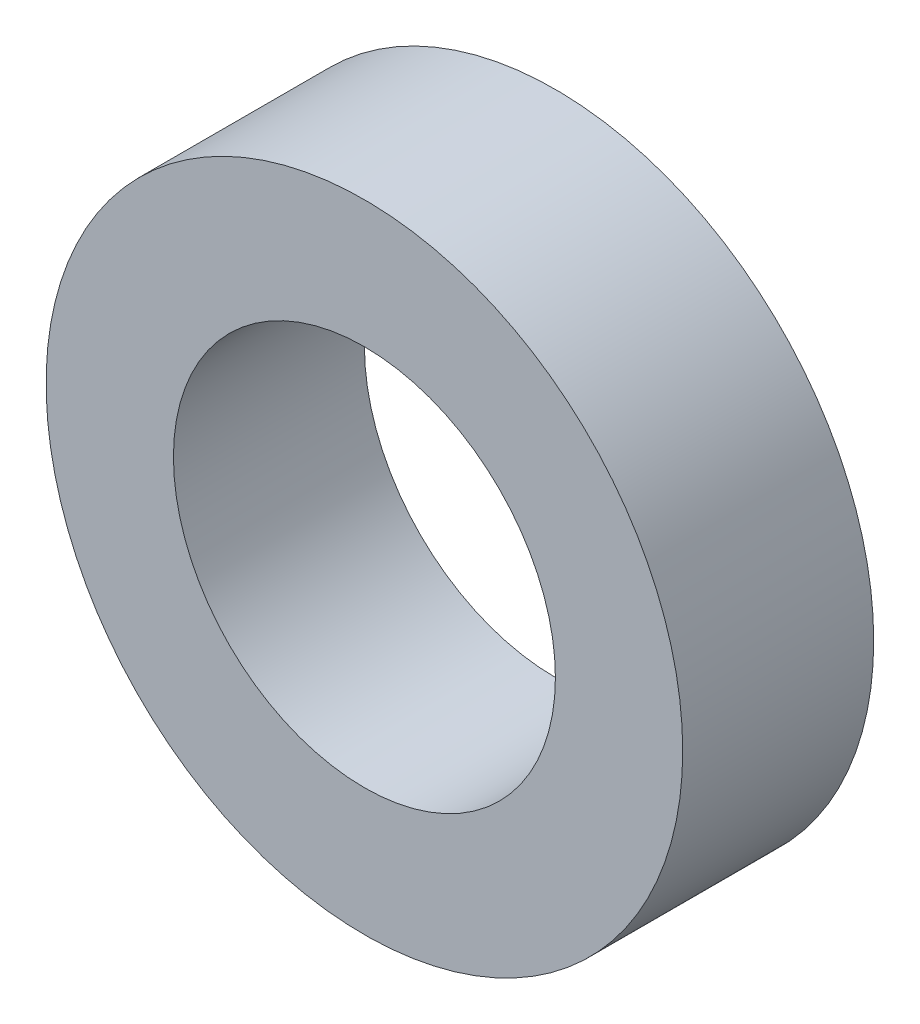
ISO-10303-21;
HEADER;
FILE_DESCRIPTION(('STEP AP214'),'2;1');
FILE_NAME('part.step','',(''),(''),'','','');
FILE_SCHEMA(('AUTOMOTIVE_DESIGN { 1 0 10303 214 1 1 1 1 }'));
ENDSEC;
DATA;
#1=APPLICATION_CONTEXT('core data for automotive mechanical design processes');
#2=APPLICATION_PROTOCOL_DEFINITION('international standard','automotive_design',2000,#1);
#3=PRODUCT_CONTEXT('',#1,'mechanical');
#4=PRODUCT('Part','Part','',(#3));
#5=PRODUCT_RELATED_PRODUCT_CATEGORY('part','',(#4));
#6=PRODUCT_DEFINITION_FORMATION('','',#4);
#7=PRODUCT_DEFINITION_CONTEXT('part definition',#1,'design');
#8=PRODUCT_DEFINITION('design','',#6,#7);
#9=PRODUCT_DEFINITION_SHAPE('','',#8);
#10=(LENGTH_UNIT() NAMED_UNIT(*) SI_UNIT(.MILLI.,.METRE.));
#11=(NAMED_UNIT(*) PLANE_ANGLE_UNIT() SI_UNIT($,.RADIAN.));
#12=(NAMED_UNIT(*) SI_UNIT($,.STERADIAN.) SOLID_ANGLE_UNIT());
#13=UNCERTAINTY_MEASURE_WITH_UNIT(LENGTH_MEASURE(1.E-05),#10,'distance_accuracy_value','');
#14=(GEOMETRIC_REPRESENTATION_CONTEXT(3) GLOBAL_UNCERTAINTY_ASSIGNED_CONTEXT((#13)) GLOBAL_UNIT_ASSIGNED_CONTEXT((#10,
#11,#12)) REPRESENTATION_CONTEXT('',''));
#15=CARTESIAN_POINT('',(0.,0.,0.));
#16=DIRECTION('',(0.,0.,1.));
#17=DIRECTION('',(1.,0.,0.));
#18=AXIS2_PLACEMENT_3D('',#15,#16,#17);
#19=CARTESIAN_POINT('',(0.,0.,6.));
#20=DIRECTION('',(0.,0.,1.));
#21=DIRECTION('',(1.,0.,0.));
#22=AXIS2_PLACEMENT_3D('',#19,#20,#21);
#23=PLANE('',#22);
#24=CARTESIAN_POINT('',(0.,0.,6.));
#25=DIRECTION('',(0.,0.,1.));
#26=DIRECTION('',(1.,0.,0.));
#27=AXIS2_PLACEMENT_3D('',#24,#25,#26);
#28=CIRCLE('',#27,10.);
#29=CARTESIAN_POINT('',(9.99999999999998,0.,5.99999999999999));
#30=VERTEX_POINT('',#29);
#31=EDGE_CURVE('E10',#30,#30,#28,.T.);
#32=ORIENTED_EDGE('',*,*,#31,.T.);
#33=EDGE_LOOP('',(#32));
#34=FACE_BOUND('',#33,.T.);
#35=CARTESIAN_POINT('',(0.,0.,6.));
#36=DIRECTION('',(0.,0.,1.));
#37=DIRECTION('',(1.,0.,0.));
#38=AXIS2_PLACEMENT_3D('',#35,#36,#37);
#39=CIRCLE('',#38,6.);
#40=CARTESIAN_POINT('',(5.99999999999998,0.,5.99999999999999));
#41=VERTEX_POINT('',#40);
#42=EDGE_CURVE('E40',#41,#41,#39,.T.);
#43=ORIENTED_EDGE('',*,*,#42,.F.);
#44=EDGE_LOOP('',(#43));
#45=FACE_BOUND('',#44,.T.);
#46=ADVANCED_FACE('F29',(#34,#45),#23,.T.);
#47=CARTESIAN_POINT('',(0.,0.,0.));
#48=DIRECTION('',(0.,0.,1.));
#49=DIRECTION('',(1.,0.,0.));
#50=AXIS2_PLACEMENT_3D('',#47,#48,#49);
#51=PLANE('',#50);
#52=CARTESIAN_POINT('',(0.,0.,0.));
#53=DIRECTION('',(0.,0.,1.));
#54=DIRECTION('',(1.,0.,0.));
#55=AXIS2_PLACEMENT_3D('',#52,#53,#54);
#56=CIRCLE('',#55,10.);
#57=CARTESIAN_POINT('',(9.99999999999999,0.,0.));
#58=VERTEX_POINT('',#57);
#59=EDGE_CURVE('E36',#58,#58,#56,.T.);
#60=ORIENTED_EDGE('',*,*,#59,.F.);
#61=EDGE_LOOP('',(#60));
#62=FACE_BOUND('',#61,.T.);
#63=CARTESIAN_POINT('',(0.,0.,0.));
#64=DIRECTION('',(0.,0.,1.));
#65=DIRECTION('',(1.,0.,0.));
#66=AXIS2_PLACEMENT_3D('',#63,#64,#65);
#67=CIRCLE('',#66,6.);
#68=CARTESIAN_POINT('',(6.,0.,0.));
#69=VERTEX_POINT('',#68);
#70=EDGE_CURVE('E44',#69,#69,#67,.T.);
#71=ORIENTED_EDGE('',*,*,#70,.T.);
#72=EDGE_LOOP('',(#71));
#73=FACE_BOUND('',#72,.T.);
#74=ADVANCED_FACE('F50',(#62,#73),#51,.F.);
#75=CARTESIAN_POINT('',(0.,0.,6.));
#76=DIRECTION('',(0.,0.,-1.));
#77=DIRECTION('',(-1.,0.,0.));
#78=AXIS2_PLACEMENT_3D('',#75,#76,#77);
#79=CYLINDRICAL_SURFACE('',#78,10.);
#80=ORIENTED_EDGE('',*,*,#31,.F.);
#81=EDGE_LOOP('',(#80));
#82=FACE_BOUND('',#81,.T.);
#83=ORIENTED_EDGE('',*,*,#59,.T.);
#84=EDGE_LOOP('',(#83));
#85=FACE_BOUND('',#84,.T.);
#86=ADVANCED_FACE('F31',(#82,#85),#79,.T.);
#87=CARTESIAN_POINT('',(0.,0.,6.));
#88=DIRECTION('',(0.,0.,-1.));
#89=DIRECTION('',(-1.,0.,0.));
#90=AXIS2_PLACEMENT_3D('',#87,#88,#89);
#91=CYLINDRICAL_SURFACE('',#90,6.);
#92=ORIENTED_EDGE('',*,*,#42,.T.);
#93=EDGE_LOOP('',(#92));
#94=FACE_BOUND('',#93,.T.);
#95=ORIENTED_EDGE('',*,*,#70,.F.);
#96=EDGE_LOOP('',(#95));
#97=FACE_BOUND('',#96,.T.);
#98=ADVANCED_FACE('F52',(#94,#97),#91,.F.);
#99=CLOSED_SHELL('',(#46,#74,#86,#98));
#100=MANIFOLD_SOLID_BREP('B2',#99);
#101=ADVANCED_BREP_SHAPE_REPRESENTATION('',(#18,#100),#14);
#102=SHAPE_DEFINITION_REPRESENTATION(#9,#101);
ENDSEC;
END-ISO-10303-21;
